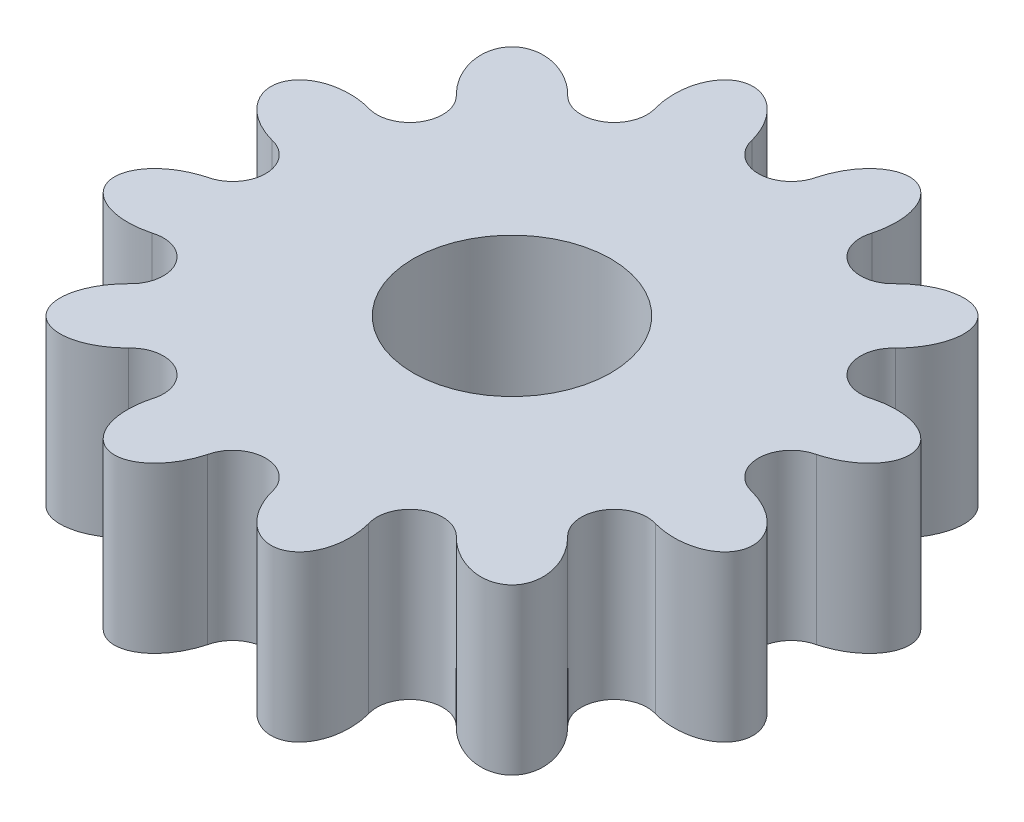
ISO-10303-21;
HEADER;
FILE_DESCRIPTION(('STEP AP214'),'2;1');
FILE_NAME('part.step','',(''),(''),'','','');
FILE_SCHEMA(('AUTOMOTIVE_DESIGN { 1 0 10303 214 1 1 1 1 }'));
ENDSEC;
DATA;
#1=APPLICATION_CONTEXT('core data for automotive mechanical design processes');
#2=APPLICATION_PROTOCOL_DEFINITION('international standard','automotive_design',2000,#1);
#3=PRODUCT_CONTEXT('',#1,'mechanical');
#4=PRODUCT('Part','Part','',(#3));
#5=PRODUCT_RELATED_PRODUCT_CATEGORY('part','',(#4));
#6=PRODUCT_DEFINITION_FORMATION('','',#4);
#7=PRODUCT_DEFINITION_CONTEXT('part definition',#1,'design');
#8=PRODUCT_DEFINITION('design','',#6,#7);
#9=PRODUCT_DEFINITION_SHAPE('','',#8);
#10=(LENGTH_UNIT() NAMED_UNIT(*) SI_UNIT(.MILLI.,.METRE.));
#11=(NAMED_UNIT(*) PLANE_ANGLE_UNIT() SI_UNIT($,.RADIAN.));
#12=(NAMED_UNIT(*) SI_UNIT($,.STERADIAN.) SOLID_ANGLE_UNIT());
#13=UNCERTAINTY_MEASURE_WITH_UNIT(LENGTH_MEASURE(1.E-05),#10,'distance_accuracy_value','');
#14=(GEOMETRIC_REPRESENTATION_CONTEXT(3) GLOBAL_UNCERTAINTY_ASSIGNED_CONTEXT((#13)) GLOBAL_UNIT_ASSIGNED_CONTEXT((#10,
#11,#12)) REPRESENTATION_CONTEXT('',''));
#15=CARTESIAN_POINT('',(0.,0.,0.));
#16=DIRECTION('',(0.,0.,1.));
#17=DIRECTION('',(1.,0.,0.));
#18=AXIS2_PLACEMENT_3D('',#15,#16,#17);
#19=CARTESIAN_POINT('',(0.,5.,-16.9523450362785));
#20=DIRECTION('',(0.,-1.,0.));
#21=DIRECTION('',(0.,0.,-1.));
#22=AXIS2_PLACEMENT_3D('',#19,#20,#21);
#23=CYLINDRICAL_SURFACE('',#22,2.);
#24=CARTESIAN_POINT('',(0.,-5.,-16.9523450362785));
#25=DIRECTION('',(0.,-1.,0.));
#26=DIRECTION('',(0.,0.,1.));
#27=AXIS2_PLACEMENT_3D('',#24,#25,#26);
#28=CIRCLE('',#27,2.);
#29=CARTESIAN_POINT('',(1.95247814611387,-5.,-16.5189525017929));
#30=VERTEX_POINT('',#29);
#31=CARTESIAN_POINT('',(-1.95247814611384,-5.,-16.5189525017929));
#32=VERTEX_POINT('',#31);
#33=EDGE_CURVE('E333',#30,#32,#28,.T.);
#34=ORIENTED_EDGE('',*,*,#33,.T.);
#35=DIRECTION('',(0.,-1.,0.));
#36=VECTOR('',#35,1.);
#37=CARTESIAN_POINT('',(-1.95247814611384,5.,-16.5189525017929));
#38=LINE('',#37,#36);
#39=CARTESIAN_POINT('',(-1.95247814611384,5.,-16.5189525017929));
#40=VERTEX_POINT('',#39);
#41=EDGE_CURVE('E233',#40,#32,#38,.T.);
#42=ORIENTED_EDGE('',*,*,#41,.F.);
#43=CARTESIAN_POINT('',(0.,5.,-16.9523450362785));
#44=DIRECTION('',(0.,-1.,0.));
#45=DIRECTION('',(0.,0.,1.));
#46=AXIS2_PLACEMENT_3D('',#43,#44,#45);
#47=CIRCLE('',#46,2.);
#48=CARTESIAN_POINT('',(1.95247814611387,5.,-16.5189525017929));
#49=VERTEX_POINT('',#48);
#50=EDGE_CURVE('E143',#49,#40,#47,.T.);
#51=ORIENTED_EDGE('',*,*,#50,.F.);
#52=DIRECTION('',(0.,-1.,0.));
#53=VECTOR('',#52,1.);
#54=CARTESIAN_POINT('',(1.95247814611387,5.,-16.5189525017929));
#55=LINE('',#54,#53);
#56=EDGE_CURVE('E49',#49,#30,#55,.T.);
#57=ORIENTED_EDGE('',*,*,#56,.T.);
#58=EDGE_LOOP('',(#34,#42,#51,#57));
#59=FACE_BOUND('',#58,.T.);
#60=ADVANCED_FACE('F50',(#59),#23,.F.);
#61=CARTESIAN_POINT('',(-8.47617251813904,5.,-14.6811614551363));
#62=DIRECTION('',(0.,-1.,0.));
#63=DIRECTION('',(0.,0.,-1.));
#64=AXIS2_PLACEMENT_3D('',#61,#62,#63);
#65=CYLINDRICAL_SURFACE('',#64,2.);
#66=CARTESIAN_POINT('',(-8.47617251813904,-5.,-14.6811614551363));
#67=DIRECTION('',(0.,-1.,0.));
#68=DIRECTION('',(0.,0.,1.));
#69=AXIS2_PLACEMENT_3D('',#66,#67,#68);
#70=CIRCLE('',#69,2.);
#71=CARTESIAN_POINT('',(-6.56858057602771,-5.,-15.2820715835182));
#72=VERTEX_POINT('',#71);
#73=CARTESIAN_POINT('',(-9.95037192576501,-5.,-13.3295934374043));
#74=VERTEX_POINT('',#73);
#75=EDGE_CURVE('E325',#72,#74,#70,.T.);
#76=ORIENTED_EDGE('',*,*,#75,.T.);
#77=DIRECTION('',(0.,-1.,0.));
#78=VECTOR('',#77,1.);
#79=CARTESIAN_POINT('',(-9.95037192576483,5.,-13.3295934374044));
#80=LINE('',#79,#78);
#81=CARTESIAN_POINT('',(-9.95037192576501,5.,-13.3295934374043));
#82=VERTEX_POINT('',#81);
#83=EDGE_CURVE('E223',#82,#74,#80,.T.);
#84=ORIENTED_EDGE('',*,*,#83,.F.);
#85=CARTESIAN_POINT('',(-8.47617251813904,5.,-14.6811614551363));
#86=DIRECTION('',(0.,-1.,0.));
#87=DIRECTION('',(0.,0.,1.));
#88=AXIS2_PLACEMENT_3D('',#85,#86,#87);
#89=CIRCLE('',#88,2.);
#90=CARTESIAN_POINT('',(-6.56858057602792,5.,-15.2820715835181));
#91=VERTEX_POINT('',#90);
#92=EDGE_CURVE('E525',#91,#82,#89,.T.);
#93=ORIENTED_EDGE('',*,*,#92,.F.);
#94=DIRECTION('',(0.,-1.,0.));
#95=VECTOR('',#94,1.);
#96=CARTESIAN_POINT('',(-6.56858057602771,5.,-15.2820715835182));
#97=LINE('',#96,#95);
#98=EDGE_CURVE('E226',#91,#72,#97,.T.);
#99=ORIENTED_EDGE('',*,*,#98,.T.);
#100=EDGE_LOOP('',(#76,#84,#93,#99));
#101=FACE_BOUND('',#100,.T.);
#102=ADVANCED_FACE('F313',(#101),#65,.F.);
#103=CARTESIAN_POINT('',(-14.6811614551361,5.,-8.47617251813942));
#104=DIRECTION('',(0.,-1.,0.));
#105=DIRECTION('',(0.,0.,-1.));
#106=AXIS2_PLACEMENT_3D('',#103,#104,#105);
#107=CYLINDRICAL_SURFACE('',#106,2.);
#108=CARTESIAN_POINT('',(-14.6811614551361,-5.,-8.47617251813942));
#109=DIRECTION('',(0.,-1.,0.));
#110=DIRECTION('',(0.,0.,1.));
#111=AXIS2_PLACEMENT_3D('',#108,#109,#110);
#112=CIRCLE('',#111,2.);
#113=CARTESIAN_POINT('',(-13.3295934374041,-5.,-9.95037192576517));
#114=VERTEX_POINT('',#113);
#115=CARTESIAN_POINT('',(-15.2820715835181,-5.,-6.5685805760279));
#116=VERTEX_POINT('',#115);
#117=EDGE_CURVE('E332',#114,#116,#112,.T.);
#118=ORIENTED_EDGE('',*,*,#117,.T.);
#119=DIRECTION('',(0.,-1.,0.));
#120=VECTOR('',#119,1.);
#121=CARTESIAN_POINT('',(-15.282071583518,5.,-6.56858057602811));
#122=LINE('',#121,#120);
#123=CARTESIAN_POINT('',(-15.2820715835181,5.,-6.5685805760279));
#124=VERTEX_POINT('',#123);
#125=EDGE_CURVE('E216',#124,#116,#122,.T.);
#126=ORIENTED_EDGE('',*,*,#125,.F.);
#127=CARTESIAN_POINT('',(-14.6811614551361,5.,-8.47617251813942));
#128=DIRECTION('',(0.,-1.,0.));
#129=DIRECTION('',(0.,0.,1.));
#130=AXIS2_PLACEMENT_3D('',#127,#128,#129);
#131=CIRCLE('',#130,2.);
#132=CARTESIAN_POINT('',(-13.3295934374043,5.,-9.95037192576499));
#133=VERTEX_POINT('',#132);
#134=EDGE_CURVE('E521',#133,#124,#131,.T.);
#135=ORIENTED_EDGE('',*,*,#134,.F.);
#136=DIRECTION('',(0.,-1.,0.));
#137=VECTOR('',#136,1.);
#138=CARTESIAN_POINT('',(-13.3295934374041,5.,-9.95037192576517));
#139=LINE('',#138,#137);
#140=EDGE_CURVE('E220',#133,#114,#139,.T.);
#141=ORIENTED_EDGE('',*,*,#140,.T.);
#142=EDGE_LOOP('',(#118,#126,#135,#141));
#143=FACE_BOUND('',#142,.T.);
#144=ADVANCED_FACE('F311',(#143),#107,.F.);
#145=CARTESIAN_POINT('',(-16.9523450362785,5.,-1.91606807165076E-13));
#146=DIRECTION('',(0.,-1.,0.));
#147=DIRECTION('',(0.,0.,-1.));
#148=AXIS2_PLACEMENT_3D('',#145,#146,#147);
#149=CYLINDRICAL_SURFACE('',#148,2.);
#150=CARTESIAN_POINT('',(-16.9523450362785,-5.,-1.91606807165076E-13));
#151=DIRECTION('',(0.,-1.,0.));
#152=DIRECTION('',(0.,0.,1.));
#153=AXIS2_PLACEMENT_3D('',#150,#151,#152);
#154=CIRCLE('',#153,2.);
#155=CARTESIAN_POINT('',(-16.5189525017929,-5.,-1.95247814611404));
#156=VERTEX_POINT('',#155);
#157=CARTESIAN_POINT('',(-16.5189525017929,-5.,1.9524781461139));
#158=VERTEX_POINT('',#157);
#159=EDGE_CURVE('E339',#156,#158,#154,.T.);
#160=ORIENTED_EDGE('',*,*,#159,.T.);
#161=DIRECTION('',(0.,-1.,0.));
#162=VECTOR('',#161,1.);
#163=CARTESIAN_POINT('',(-16.518952501793,5.,1.95247814611367));
#164=LINE('',#163,#162);
#165=CARTESIAN_POINT('',(-16.5189525017929,5.,1.9524781461139));
#166=VERTEX_POINT('',#165);
#167=EDGE_CURVE('E206',#166,#158,#164,.T.);
#168=ORIENTED_EDGE('',*,*,#167,.F.);
#169=CARTESIAN_POINT('',(-16.9523450362785,5.,-1.91606807165076E-13));
#170=DIRECTION('',(0.,-1.,0.));
#171=DIRECTION('',(0.,0.,1.));
#172=AXIS2_PLACEMENT_3D('',#169,#170,#171);
#173=CIRCLE('',#172,2.);
#174=CARTESIAN_POINT('',(-16.5189525017929,5.,-1.95247814611381));
#175=VERTEX_POINT('',#174);
#176=EDGE_CURVE('E517',#175,#166,#173,.T.);
#177=ORIENTED_EDGE('',*,*,#176,.F.);
#178=DIRECTION('',(0.,-1.,0.));
#179=VECTOR('',#178,1.);
#180=CARTESIAN_POINT('',(-16.5189525017929,5.,-1.95247814611404));
#181=LINE('',#180,#179);
#182=EDGE_CURVE('E212',#175,#156,#181,.T.);
#183=ORIENTED_EDGE('',*,*,#182,.T.);
#184=EDGE_LOOP('',(#160,#168,#177,#183));
#185=FACE_BOUND('',#184,.T.);
#186=ADVANCED_FACE('F310',(#185),#149,.F.);
#187=CARTESIAN_POINT('',(-14.6811614551363,5.,8.47617251813909));
#188=DIRECTION('',(0.,-1.,0.));
#189=DIRECTION('',(0.,0.,-1.));
#190=AXIS2_PLACEMENT_3D('',#187,#188,#189);
#191=CYLINDRICAL_SURFACE('',#190,2.);
#192=CARTESIAN_POINT('',(-14.6811614551363,-5.,8.47617251813909));
#193=DIRECTION('',(0.,-1.,0.));
#194=DIRECTION('',(0.,0.,1.));
#195=AXIS2_PLACEMENT_3D('',#192,#193,#194);
#196=CIRCLE('',#195,2.);
#197=CARTESIAN_POINT('',(-15.2820715835182,-5.,6.56858057602776));
#198=VERTEX_POINT('',#197);
#199=CARTESIAN_POINT('',(-13.3295934374042,-5.,9.95037192576506));
#200=VERTEX_POINT('',#199);
#201=EDGE_CURVE('E349',#198,#200,#196,.T.);
#202=ORIENTED_EDGE('',*,*,#201,.T.);
#203=DIRECTION('',(0.,-1.,0.));
#204=VECTOR('',#203,1.);
#205=CARTESIAN_POINT('',(-13.3295934374044,5.,9.95037192576487));
#206=LINE('',#205,#204);
#207=CARTESIAN_POINT('',(-13.3295934374042,5.,9.95037192576506));
#208=VERTEX_POINT('',#207);
#209=EDGE_CURVE('E200',#208,#200,#206,.T.);
#210=ORIENTED_EDGE('',*,*,#209,.F.);
#211=CARTESIAN_POINT('',(-14.6811614551363,5.,8.47617251813909));
#212=DIRECTION('',(0.,-1.,0.));
#213=DIRECTION('',(0.,0.,1.));
#214=AXIS2_PLACEMENT_3D('',#211,#212,#213);
#215=CIRCLE('',#214,2.);
#216=CARTESIAN_POINT('',(-15.2820715835181,5.,6.56858057602798));
#217=VERTEX_POINT('',#216);
#218=EDGE_CURVE('E514',#217,#208,#215,.T.);
#219=ORIENTED_EDGE('',*,*,#218,.F.);
#220=DIRECTION('',(0.,-1.,0.));
#221=VECTOR('',#220,1.);
#222=CARTESIAN_POINT('',(-15.2820715835182,5.,6.56858057602776));
#223=LINE('',#222,#221);
#224=EDGE_CURVE('E203',#217,#198,#223,.T.);
#225=ORIENTED_EDGE('',*,*,#224,.T.);
#226=EDGE_LOOP('',(#202,#210,#219,#225));
#227=FACE_BOUND('',#226,.T.);
#228=ADVANCED_FACE('F303',(#227),#191,.F.);
#229=CARTESIAN_POINT('',(-8.47617251813937,5.,14.6811614551361));
#230=DIRECTION('',(0.,-1.,0.));
#231=DIRECTION('',(0.,0.,-1.));
#232=AXIS2_PLACEMENT_3D('',#229,#230,#231);
#233=CYLINDRICAL_SURFACE('',#232,2.);
#234=CARTESIAN_POINT('',(-8.47617251813937,-5.,14.6811614551361));
#235=DIRECTION('',(0.,-1.,0.));
#236=DIRECTION('',(0.,0.,1.));
#237=AXIS2_PLACEMENT_3D('',#234,#235,#236);
#238=CIRCLE('',#237,2.);
#239=CARTESIAN_POINT('',(-9.95037192576513,-5.,13.3295934374042));
#240=VERTEX_POINT('',#239);
#241=CARTESIAN_POINT('',(-6.56858057602795,-5.,15.2820715835181));
#242=VERTEX_POINT('',#241);
#243=EDGE_CURVE('E355',#240,#242,#238,.T.);
#244=ORIENTED_EDGE('',*,*,#243,.T.);
#245=DIRECTION('',(0.,-1.,0.));
#246=VECTOR('',#245,1.);
#247=CARTESIAN_POINT('',(-6.56858057602806,5.,15.2820715835181));
#248=LINE('',#247,#246);
#249=CARTESIAN_POINT('',(-6.56858057602795,5.,15.2820715835181));
#250=VERTEX_POINT('',#249);
#251=EDGE_CURVE('E192',#250,#242,#248,.T.);
#252=ORIENTED_EDGE('',*,*,#251,.F.);
#253=CARTESIAN_POINT('',(-8.47617251813937,5.,14.6811614551361));
#254=DIRECTION('',(0.,-1.,0.));
#255=DIRECTION('',(0.,0.,1.));
#256=AXIS2_PLACEMENT_3D('',#253,#254,#255);
#257=CIRCLE('',#256,2.);
#258=CARTESIAN_POINT('',(-9.95037192576494,5.,13.3295934374043));
#259=VERTEX_POINT('',#258);
#260=EDGE_CURVE('E508',#259,#250,#257,.T.);
#261=ORIENTED_EDGE('',*,*,#260,.F.);
#262=DIRECTION('',(0.,-1.,0.));
#263=VECTOR('',#262,1.);
#264=CARTESIAN_POINT('',(-9.95037192576513,5.,13.3295934374042));
#265=LINE('',#264,#263);
#266=EDGE_CURVE('E196',#259,#240,#265,.T.);
#267=ORIENTED_EDGE('',*,*,#266,.T.);
#268=EDGE_LOOP('',(#244,#252,#261,#267));
#269=FACE_BOUND('',#268,.T.);
#270=ADVANCED_FACE('F299',(#269),#233,.F.);
#271=CARTESIAN_POINT('',(-1.3241801082128E-13,5.,16.9523450362785));
#272=DIRECTION('',(0.,-1.,0.));
#273=DIRECTION('',(0.,0.,-1.));
#274=AXIS2_PLACEMENT_3D('',#271,#272,#273);
#275=CYLINDRICAL_SURFACE('',#274,2.);
#276=CARTESIAN_POINT('',(-1.3241801082128E-13,-5.,16.9523450362785));
#277=DIRECTION('',(0.,-1.,0.));
#278=DIRECTION('',(0.,0.,1.));
#279=AXIS2_PLACEMENT_3D('',#276,#277,#278);
#280=CIRCLE('',#279,2.);
#281=CARTESIAN_POINT('',(-1.95247814611398,-5.,16.5189525017929));
#282=VERTEX_POINT('',#281);
#283=CARTESIAN_POINT('',(1.95247814611396,-5.,16.5189525017929));
#284=VERTEX_POINT('',#283);
#285=EDGE_CURVE('E358',#282,#284,#280,.T.);
#286=ORIENTED_EDGE('',*,*,#285,.T.);
#287=DIRECTION('',(0.,-1.,0.));
#288=VECTOR('',#287,1.);
#289=CARTESIAN_POINT('',(1.95247814611373,5.,16.5189525017929));
#290=LINE('',#289,#288);
#291=CARTESIAN_POINT('',(1.95247814611396,5.,16.5189525017929));
#292=VERTEX_POINT('',#291);
#293=EDGE_CURVE('E183',#292,#284,#290,.T.);
#294=ORIENTED_EDGE('',*,*,#293,.F.);
#295=CARTESIAN_POINT('',(-1.3241801082128E-13,5.,16.9523450362785));
#296=DIRECTION('',(0.,-1.,0.));
#297=DIRECTION('',(0.,0.,1.));
#298=AXIS2_PLACEMENT_3D('',#295,#296,#297);
#299=CIRCLE('',#298,2.);
#300=CARTESIAN_POINT('',(-1.95247814611387,5.,16.5189525017929));
#301=VERTEX_POINT('',#300);
#302=EDGE_CURVE('E504',#301,#292,#299,.T.);
#303=ORIENTED_EDGE('',*,*,#302,.F.);
#304=DIRECTION('',(0.,-1.,0.));
#305=VECTOR('',#304,1.);
#306=CARTESIAN_POINT('',(-1.95247814611398,5.,16.5189525017929));
#307=LINE('',#306,#305);
#308=EDGE_CURVE('E189',#301,#282,#307,.T.);
#309=ORIENTED_EDGE('',*,*,#308,.T.);
#310=EDGE_LOOP('',(#286,#294,#303,#309));
#311=FACE_BOUND('',#310,.T.);
#312=ADVANCED_FACE('F294',(#311),#275,.F.);
#313=CARTESIAN_POINT('',(8.47617251813914,5.,14.6811614551362));
#314=DIRECTION('',(0.,-1.,0.));
#315=DIRECTION('',(0.,0.,-1.));
#316=AXIS2_PLACEMENT_3D('',#313,#314,#315);
#317=CYLINDRICAL_SURFACE('',#316,2.);
#318=CARTESIAN_POINT('',(8.47617251813914,-5.,14.6811614551362));
#319=DIRECTION('',(0.,-1.,0.));
#320=DIRECTION('',(0.,0.,1.));
#321=AXIS2_PLACEMENT_3D('',#318,#319,#320);
#322=CIRCLE('',#321,2.);
#323=CARTESIAN_POINT('',(6.56858057602782,-5.,15.2820715835181));
#324=VERTEX_POINT('',#323);
#325=CARTESIAN_POINT('',(9.9503719257651,-5.,13.3295934374042));
#326=VERTEX_POINT('',#325);
#327=EDGE_CURVE('E359',#324,#326,#322,.T.);
#328=ORIENTED_EDGE('',*,*,#327,.T.);
#329=DIRECTION('',(0.,-1.,0.));
#330=VECTOR('',#329,1.);
#331=CARTESIAN_POINT('',(9.95037192576492,5.,13.3295934374043));
#332=LINE('',#331,#330);
#333=CARTESIAN_POINT('',(9.9503719257651,5.,13.3295934374042));
#334=VERTEX_POINT('',#333);
#335=EDGE_CURVE('E176',#334,#326,#332,.T.);
#336=ORIENTED_EDGE('',*,*,#335,.F.);
#337=CARTESIAN_POINT('',(8.47617251813914,5.,14.6811614551362));
#338=DIRECTION('',(0.,-1.,0.));
#339=DIRECTION('',(0.,0.,1.));
#340=AXIS2_PLACEMENT_3D('',#337,#338,#339);
#341=CIRCLE('',#340,2.);
#342=CARTESIAN_POINT('',(6.56858057602803,5.,15.2820715835181));
#343=VERTEX_POINT('',#342);
#344=EDGE_CURVE('E501',#343,#334,#341,.T.);
#345=ORIENTED_EDGE('',*,*,#344,.F.);
#346=DIRECTION('',(0.,-1.,0.));
#347=VECTOR('',#346,1.);
#348=CARTESIAN_POINT('',(6.56858057602782,5.,15.2820715835181));
#349=LINE('',#348,#347);
#350=EDGE_CURVE('E179',#343,#324,#349,.T.);
#351=ORIENTED_EDGE('',*,*,#350,.T.);
#352=EDGE_LOOP('',(#328,#336,#345,#351));
#353=FACE_BOUND('',#352,.T.);
#354=ADVANCED_FACE('F293',(#353),#317,.F.);
#355=CARTESIAN_POINT('',(14.6811614551361,5.,8.47617251813932));
#356=DIRECTION('',(0.,-1.,0.));
#357=DIRECTION('',(0.,0.,-1.));
#358=AXIS2_PLACEMENT_3D('',#355,#356,#357);
#359=CYLINDRICAL_SURFACE('',#358,2.);
#360=CARTESIAN_POINT('',(14.6811614551361,-5.,8.47617251813932));
#361=DIRECTION('',(0.,-1.,0.));
#362=DIRECTION('',(0.,0.,1.));
#363=AXIS2_PLACEMENT_3D('',#360,#361,#362);
#364=CIRCLE('',#363,2.);
#365=CARTESIAN_POINT('',(13.3295934374042,-5.,9.95037192576508));
#366=VERTEX_POINT('',#365);
#367=CARTESIAN_POINT('',(15.2820715835182,-5.,6.56858057602779));
#368=VERTEX_POINT('',#367);
#369=EDGE_CURVE('E147',#366,#368,#364,.T.);
#370=ORIENTED_EDGE('',*,*,#369,.T.);
#371=DIRECTION('',(0.,-1.,0.));
#372=VECTOR('',#371,1.);
#373=CARTESIAN_POINT('',(15.2820715835181,5.,6.568580576028));
#374=LINE('',#373,#372);
#375=CARTESIAN_POINT('',(15.2820715835182,5.,6.56858057602779));
#376=VERTEX_POINT('',#375);
#377=EDGE_CURVE('E166',#376,#368,#374,.T.);
#378=ORIENTED_EDGE('',*,*,#377,.F.);
#379=CARTESIAN_POINT('',(14.6811614551361,5.,8.47617251813932));
#380=DIRECTION('',(0.,-1.,0.));
#381=DIRECTION('',(0.,0.,1.));
#382=AXIS2_PLACEMENT_3D('',#379,#380,#381);
#383=CIRCLE('',#382,2.);
#384=CARTESIAN_POINT('',(13.3295934374043,5.,9.95037192576489));
#385=VERTEX_POINT('',#384);
#386=EDGE_CURVE('E500',#385,#376,#383,.T.);
#387=ORIENTED_EDGE('',*,*,#386,.F.);
#388=DIRECTION('',(0.,-1.,0.));
#389=VECTOR('',#388,1.);
#390=CARTESIAN_POINT('',(13.3295934374042,5.,9.95037192576508));
#391=LINE('',#390,#389);
#392=EDGE_CURVE('E175',#385,#366,#391,.T.);
#393=ORIENTED_EDGE('',*,*,#392,.T.);
#394=EDGE_LOOP('',(#370,#378,#387,#393));
#395=FACE_BOUND('',#394,.T.);
#396=ADVANCED_FACE('F290',(#395),#359,.F.);
#397=CARTESIAN_POINT('',(16.9523450362785,5.,0.));
#398=DIRECTION('',(0.,-1.,0.));
#399=DIRECTION('',(0.,0.,-1.));
#400=AXIS2_PLACEMENT_3D('',#397,#398,#399);
#401=CYLINDRICAL_SURFACE('',#400,2.);
#402=CARTESIAN_POINT('',(16.9523450362785,-5.,0.));
#403=DIRECTION('',(0.,-1.,0.));
#404=DIRECTION('',(0.,0.,1.));
#405=AXIS2_PLACEMENT_3D('',#402,#403,#404);
#406=CIRCLE('',#405,2.);
#407=CARTESIAN_POINT('',(16.5189525017929,-5.,1.95247814611393));
#408=VERTEX_POINT('',#407);
#409=CARTESIAN_POINT('',(16.5189525017929,-5.,-1.95247814611401));
#410=VERTEX_POINT('',#409);
#411=EDGE_CURVE('E139',#408,#410,#406,.T.);
#412=ORIENTED_EDGE('',*,*,#411,.T.);
#413=DIRECTION('',(0.,-1.,0.));
#414=VECTOR('',#413,1.);
#415=CARTESIAN_POINT('',(16.5189525017929,5.,-1.95247814611378));
#416=LINE('',#415,#414);
#417=CARTESIAN_POINT('',(16.5189525017929,5.,-1.95247814611401));
#418=VERTEX_POINT('',#417);
#419=EDGE_CURVE('E112',#418,#410,#416,.T.);
#420=ORIENTED_EDGE('',*,*,#419,.F.);
#421=CARTESIAN_POINT('',(16.9523450362785,5.,0.));
#422=DIRECTION('',(0.,-1.,0.));
#423=DIRECTION('',(0.,0.,1.));
#424=AXIS2_PLACEMENT_3D('',#421,#422,#423);
#425=CIRCLE('',#424,2.);
#426=CARTESIAN_POINT('',(16.5189525017929,5.,1.9524781461137));
#427=VERTEX_POINT('',#426);
#428=EDGE_CURVE('E493',#427,#418,#425,.T.);
#429=ORIENTED_EDGE('',*,*,#428,.F.);
#430=DIRECTION('',(0.,-1.,0.));
#431=VECTOR('',#430,1.);
#432=CARTESIAN_POINT('',(16.5189525017929,5.,1.95247814611393));
#433=LINE('',#432,#431);
#434=EDGE_CURVE('E165',#427,#408,#433,.T.);
#435=ORIENTED_EDGE('',*,*,#434,.T.);
#436=EDGE_LOOP('',(#412,#420,#429,#435));
#437=FACE_BOUND('',#436,.T.);
#438=ADVANCED_FACE('F283',(#437),#401,.F.);
#439=CARTESIAN_POINT('',(14.6811614551362,5.,-8.47617251813919));
#440=DIRECTION('',(0.,-1.,0.));
#441=DIRECTION('',(0.,0.,-1.));
#442=AXIS2_PLACEMENT_3D('',#439,#440,#441);
#443=CYLINDRICAL_SURFACE('',#442,2.);
#444=CARTESIAN_POINT('',(14.6811614551362,-5.,-8.47617251813919));
#445=DIRECTION('',(0.,-1.,0.));
#446=DIRECTION('',(0.,0.,1.));
#447=AXIS2_PLACEMENT_3D('',#444,#445,#446);
#448=CIRCLE('',#447,2.);
#449=CARTESIAN_POINT('',(15.2820715835181,-5.,-6.56858057602787));
#450=VERTEX_POINT('',#449);
#451=CARTESIAN_POINT('',(13.3295934374042,-5.,-9.95037192576515));
#452=VERTEX_POINT('',#451);
#453=EDGE_CURVE('E129',#450,#452,#448,.T.);
#454=ORIENTED_EDGE('',*,*,#453,.T.);
#455=DIRECTION('',(0.,-1.,0.));
#456=VECTOR('',#455,1.);
#457=CARTESIAN_POINT('',(13.3295934374043,5.,-9.95037192576496));
#458=LINE('',#457,#456);
#459=CARTESIAN_POINT('',(13.3295934374042,5.,-9.95037192576515));
#460=VERTEX_POINT('',#459);
#461=EDGE_CURVE('E132',#460,#452,#458,.T.);
#462=ORIENTED_EDGE('',*,*,#461,.F.);
#463=CARTESIAN_POINT('',(14.6811614551362,5.,-8.47617251813919));
#464=DIRECTION('',(0.,-1.,0.));
#465=DIRECTION('',(0.,0.,1.));
#466=AXIS2_PLACEMENT_3D('',#463,#464,#465);
#467=CIRCLE('',#466,2.);
#468=CARTESIAN_POINT('',(15.282071583518,5.,-6.56858057602808));
#469=VERTEX_POINT('',#468);
#470=EDGE_CURVE('E130',#469,#460,#467,.T.);
#471=ORIENTED_EDGE('',*,*,#470,.F.);
#472=DIRECTION('',(0.,-1.,0.));
#473=VECTOR('',#472,1.);
#474=CARTESIAN_POINT('',(15.2820715835181,5.,-6.56858057602787));
#475=LINE('',#474,#473);
#476=EDGE_CURVE('E109',#469,#450,#475,.T.);
#477=ORIENTED_EDGE('',*,*,#476,.T.);
#478=EDGE_LOOP('',(#454,#462,#471,#477));
#479=FACE_BOUND('',#478,.T.);
#480=ADVANCED_FACE('F123',(#479),#443,.F.);
#481=CARTESIAN_POINT('',(8.47617251813927,5.,-14.6811614551362));
#482=DIRECTION('',(0.,-1.,0.));
#483=DIRECTION('',(0.,0.,-1.));
#484=AXIS2_PLACEMENT_3D('',#481,#482,#483);
#485=CYLINDRICAL_SURFACE('',#484,2.);
#486=CARTESIAN_POINT('',(8.47617251813927,-5.,-14.6811614551362));
#487=DIRECTION('',(0.,-1.,0.));
#488=DIRECTION('',(0.,0.,1.));
#489=AXIS2_PLACEMENT_3D('',#486,#487,#488);
#490=CIRCLE('',#489,2.);
#491=CARTESIAN_POINT('',(9.95037192576503,-5.,-13.3295934374042));
#492=VERTEX_POINT('',#491);
#493=CARTESIAN_POINT('',(6.56858057602795,-5.,-15.2820715835181));
#494=VERTEX_POINT('',#493);
#495=EDGE_CURVE('E138',#492,#494,#490,.T.);
#496=ORIENTED_EDGE('',*,*,#495,.T.);
#497=DIRECTION('',(0.,-1.,0.));
#498=VECTOR('',#497,1.);
#499=CARTESIAN_POINT('',(6.56858057602795,5.,-15.2820715835181));
#500=LINE('',#499,#498);
#501=CARTESIAN_POINT('',(6.56858057602795,5.,-15.2820715835181));
#502=VERTEX_POINT('',#501);
#503=EDGE_CURVE('E151',#502,#494,#500,.T.);
#504=ORIENTED_EDGE('',*,*,#503,.F.);
#505=CARTESIAN_POINT('',(8.47617251813927,5.,-14.6811614551362));
#506=DIRECTION('',(0.,-1.,0.));
#507=DIRECTION('',(0.,0.,1.));
#508=AXIS2_PLACEMENT_3D('',#505,#506,#507);
#509=CIRCLE('',#508,2.);
#510=CARTESIAN_POINT('',(9.95037192576484,5.,-13.3295934374044));
#511=VERTEX_POINT('',#510);
#512=EDGE_CURVE('E155',#511,#502,#509,.T.);
#513=ORIENTED_EDGE('',*,*,#512,.F.);
#514=DIRECTION('',(0.,-1.,0.));
#515=VECTOR('',#514,1.);
#516=CARTESIAN_POINT('',(9.95037192576503,5.,-13.3295934374042));
#517=LINE('',#516,#515);
#518=EDGE_CURVE('E153',#511,#492,#517,.T.);
#519=ORIENTED_EDGE('',*,*,#518,.T.);
#520=EDGE_LOOP('',(#496,#504,#513,#519));
#521=FACE_BOUND('',#520,.T.);
#522=ADVANCED_FACE('F274',(#521),#485,.F.);
#523=CARTESIAN_POINT('',(0.,5.,0.));
#524=DIRECTION('',(0.,1.,0.));
#525=DIRECTION('',(0.,0.,1.));
#526=AXIS2_PLACEMENT_3D('',#523,#524,#525);
#527=PLANE('',#526);
#528=CARTESIAN_POINT('',(-11.6399826815846,5.,-11.6399826815846));
#529=DIRECTION('',(0.,-1.,0.));
#530=DIRECTION('',(0.707106781186549,0.,0.707106781186547));
#531=AXIS2_PLACEMENT_3D('',#528,#529,#530);
#532=ELLIPSE('',#531,3.53857862591509,2.38947044601158);
#533=EDGE_CURVE('E446',#133,#82,#532,.T.);
#534=ORIENTED_EDGE('',*,*,#533,.F.);
#535=ORIENTED_EDGE('',*,*,#134,.T.);
#536=CARTESIAN_POINT('',(-15.9005120426555,5.,-4.26052936107086));
#537=DIRECTION('',(0.,-1.,0.));
#538=DIRECTION('',(0.965925826289069,0.,0.258819045102518));
#539=AXIS2_PLACEMENT_3D('',#536,#537,#538);
#540=ELLIPSE('',#539,3.53857862591509,2.38947044601158);
#541=EDGE_CURVE('E441',#175,#124,#540,.T.);
#542=ORIENTED_EDGE('',*,*,#541,.F.);
#543=ORIENTED_EDGE('',*,*,#176,.T.);
#544=CARTESIAN_POINT('',(-15.9005120426555,5.,4.26052936107094));
#545=DIRECTION('',(0.,-1.,0.));
#546=DIRECTION('',(0.965925826289068,0.,-0.258819045102524));
#547=AXIS2_PLACEMENT_3D('',#544,#545,#546);
#548=ELLIPSE('',#547,3.53857862591509,2.38947044601158);
#549=EDGE_CURVE('E438',#217,#166,#548,.T.);
#550=ORIENTED_EDGE('',*,*,#549,.F.);
#551=ORIENTED_EDGE('',*,*,#218,.T.);
#552=CARTESIAN_POINT('',(-11.6399826815846,5.,11.6399826815847));
#553=DIRECTION('',(0.,-1.,0.));
#554=DIRECTION('',(0.707106781186544,0.,-0.707106781186551));
#555=AXIS2_PLACEMENT_3D('',#552,#553,#554);
#556=ELLIPSE('',#555,3.53857862591509,2.38947044601158);
#557=EDGE_CURVE('E415',#259,#208,#556,.T.);
#558=ORIENTED_EDGE('',*,*,#557,.F.);
#559=ORIENTED_EDGE('',*,*,#260,.T.);
#560=CARTESIAN_POINT('',(-4.26052936107091,5.,15.9005120426555));
#561=DIRECTION('',(0.,-1.,0.));
#562=DIRECTION('',(0.258819045102522,0.,-0.965925826289068));
#563=AXIS2_PLACEMENT_3D('',#560,#561,#562);
#564=ELLIPSE('',#563,3.53857862591509,2.38947044601158);
#565=EDGE_CURVE('E406',#301,#250,#564,.T.);
#566=ORIENTED_EDGE('',*,*,#565,.F.);
#567=ORIENTED_EDGE('',*,*,#302,.T.);
#568=CARTESIAN_POINT('',(4.26052936107099,5.,15.9005120426555));
#569=DIRECTION('',(0.,-1.,0.));
#570=DIRECTION('',(-0.258819045102528,0.,-0.965925826289067));
#571=AXIS2_PLACEMENT_3D('',#568,#569,#570);
#572=ELLIPSE('',#571,3.53857862591509,2.38947044601158);
#573=EDGE_CURVE('E401',#343,#292,#572,.T.);
#574=ORIENTED_EDGE('',*,*,#573,.F.);
#575=ORIENTED_EDGE('',*,*,#344,.T.);
#576=CARTESIAN_POINT('',(11.6399826815847,5.,11.6399826815845));
#577=DIRECTION('',(0.,-1.,0.));
#578=DIRECTION('',(-0.707106781186554,0.,-0.707106781186542));
#579=AXIS2_PLACEMENT_3D('',#576,#577,#578);
#580=ELLIPSE('',#579,3.53857862591509,2.38947044601158);
#581=EDGE_CURVE('E388',#385,#334,#580,.T.);
#582=ORIENTED_EDGE('',*,*,#581,.F.);
#583=ORIENTED_EDGE('',*,*,#386,.T.);
#584=CARTESIAN_POINT('',(15.9005120426556,5.,4.26052936107074));
#585=DIRECTION('',(0.,-1.,0.));
#586=DIRECTION('',(-0.965925826289071,0.,-0.258819045102512));
#587=AXIS2_PLACEMENT_3D('',#584,#585,#586);
#588=ELLIPSE('',#587,3.53857862591509,2.38947044601158);
#589=EDGE_CURVE('E390',#427,#376,#588,.T.);
#590=ORIENTED_EDGE('',*,*,#589,.F.);
#591=ORIENTED_EDGE('',*,*,#428,.T.);
#592=CARTESIAN_POINT('',(15.9005120426555,5.,-4.26052936107105));
#593=DIRECTION('',(0.,-1.,0.));
#594=DIRECTION('',(-0.965925826289066,0.,0.258819045102531));
#595=AXIS2_PLACEMENT_3D('',#592,#593,#594);
#596=ELLIPSE('',#595,3.53857862591509,2.38947044601158);
#597=EDGE_CURVE('E469',#469,#418,#596,.T.);
#598=ORIENTED_EDGE('',*,*,#597,.F.);
#599=ORIENTED_EDGE('',*,*,#470,.T.);
#600=CARTESIAN_POINT('',(11.6399826815845,5.,-11.6399826815848));
#601=DIRECTION('',(0.,-1.,0.));
#602=DIRECTION('',(-0.707106781186539,0.,0.707106781186556));
#603=AXIS2_PLACEMENT_3D('',#600,#601,#602);
#604=ELLIPSE('',#603,3.53857862591509,2.38947044601158);
#605=EDGE_CURVE('E467',#511,#460,#604,.T.);
#606=ORIENTED_EDGE('',*,*,#605,.F.);
#607=ORIENTED_EDGE('',*,*,#512,.T.);
#608=CARTESIAN_POINT('',(4.26052936107091,5.,-15.9005120426555));
#609=DIRECTION('',(0.,-1.,0.));
#610=DIRECTION('',(-0.258819045102522,0.,0.965925826289068));
#611=AXIS2_PLACEMENT_3D('',#608,#609,#610);
#612=ELLIPSE('',#611,3.53857862591509,2.38947044601158);
#613=EDGE_CURVE('E65',#49,#502,#612,.T.);
#614=ORIENTED_EDGE('',*,*,#613,.F.);
#615=ORIENTED_EDGE('',*,*,#50,.T.);
#616=CARTESIAN_POINT('',(-4.26052936107088,5.,-15.9005120426555));
#617=DIRECTION('',(0.,-1.,0.));
#618=DIRECTION('',(0.258819045102521,0.,0.965925826289068));
#619=AXIS2_PLACEMENT_3D('',#616,#617,#618);
#620=ELLIPSE('',#619,3.53857862591509,2.38947044601158);
#621=EDGE_CURVE('E257',#91,#40,#620,.T.);
#622=ORIENTED_EDGE('',*,*,#621,.F.);
#623=ORIENTED_EDGE('',*,*,#92,.T.);
#624=EDGE_LOOP('',(#534,#535,#542,#543,#550,#551,#558,#559,#566,#567,#574,#575,#582,#583,#590,
#591,#598,#599,#606,#607,#614,#615,#622,#623));
#625=FACE_BOUND('',#624,.T.);
#626=CARTESIAN_POINT('',(0.,5.,0.));
#627=DIRECTION('',(0.,1.,0.));
#628=DIRECTION('',(0.,0.,1.));
#629=AXIS2_PLACEMENT_3D('',#626,#627,#628);
#630=CIRCLE('',#629,6.);
#631=CARTESIAN_POINT('',(0.,5.,6.));
#632=VERTEX_POINT('',#631);
#633=EDGE_CURVE('E535',#632,#632,#630,.T.);
#634=ORIENTED_EDGE('',*,*,#633,.F.);
#635=EDGE_LOOP('',(#634));
#636=FACE_BOUND('',#635,.T.);
#637=ADVANCED_FACE('F272',(#625,#636),#527,.T.);
#638=CARTESIAN_POINT('',(0.,-5.,0.));
#639=DIRECTION('',(0.,1.,0.));
#640=DIRECTION('',(0.,0.,1.));
#641=AXIS2_PLACEMENT_3D('',#638,#639,#640);
#642=PLANE('',#641);
#643=CARTESIAN_POINT('',(0.,-5.,0.));
#644=DIRECTION('',(0.,1.,0.));
#645=DIRECTION('',(0.,0.,1.));
#646=AXIS2_PLACEMENT_3D('',#643,#644,#645);
#647=CIRCLE('',#646,6.);
#648=CARTESIAN_POINT('',(0.,-5.,6.));
#649=VERTEX_POINT('',#648);
#650=EDGE_CURVE('E341',#649,#649,#647,.T.);
#651=ORIENTED_EDGE('',*,*,#650,.T.);
#652=EDGE_LOOP('',(#651));
#653=FACE_BOUND('',#652,.T.);
#654=ORIENTED_EDGE('',*,*,#117,.F.);
#655=CARTESIAN_POINT('',(-11.6399826815846,-5.,-11.6399826815846));
#656=DIRECTION('',(0.,-1.,0.));
#657=DIRECTION('',(0.707106781186549,0.,0.707106781186547));
#658=AXIS2_PLACEMENT_3D('',#655,#656,#657);
#659=ELLIPSE('',#658,3.53857862591509,2.38947044601158);
#660=EDGE_CURVE('E11',#114,#74,#659,.T.);
#661=ORIENTED_EDGE('',*,*,#660,.T.);
#662=ORIENTED_EDGE('',*,*,#75,.F.);
#663=CARTESIAN_POINT('',(-4.26052936107088,-5.,-15.9005120426555));
#664=DIRECTION('',(0.,-1.,0.));
#665=DIRECTION('',(0.258819045102521,0.,0.965925826289068));
#666=AXIS2_PLACEMENT_3D('',#663,#664,#665);
#667=ELLIPSE('',#666,3.53857862591509,2.38947044601158);
#668=EDGE_CURVE('E247',#72,#32,#667,.T.);
#669=ORIENTED_EDGE('',*,*,#668,.T.);
#670=ORIENTED_EDGE('',*,*,#33,.F.);
#671=CARTESIAN_POINT('',(4.26052936107091,-5.,-15.9005120426555));
#672=DIRECTION('',(0.,-1.,0.));
#673=DIRECTION('',(-0.258819045102522,0.,0.965925826289068));
#674=AXIS2_PLACEMENT_3D('',#671,#672,#673);
#675=ELLIPSE('',#674,3.53857862591509,2.38947044601158);
#676=EDGE_CURVE('E241',#30,#494,#675,.T.);
#677=ORIENTED_EDGE('',*,*,#676,.T.);
#678=ORIENTED_EDGE('',*,*,#495,.F.);
#679=CARTESIAN_POINT('',(11.6399826815845,-5.,-11.6399826815848));
#680=DIRECTION('',(0.,-1.,0.));
#681=DIRECTION('',(-0.707106781186539,0.,0.707106781186556));
#682=AXIS2_PLACEMENT_3D('',#679,#680,#681);
#683=ELLIPSE('',#682,3.53857862591509,2.38947044601158);
#684=EDGE_CURVE('E122',#492,#452,#683,.T.);
#685=ORIENTED_EDGE('',*,*,#684,.T.);
#686=ORIENTED_EDGE('',*,*,#453,.F.);
#687=CARTESIAN_POINT('',(15.9005120426555,-5.,-4.26052936107105));
#688=DIRECTION('',(0.,-1.,0.));
#689=DIRECTION('',(-0.965925826289066,0.,0.258819045102531));
#690=AXIS2_PLACEMENT_3D('',#687,#688,#689);
#691=ELLIPSE('',#690,3.53857862591509,2.38947044601158);
#692=EDGE_CURVE('E102',#450,#410,#691,.T.);
#693=ORIENTED_EDGE('',*,*,#692,.T.);
#694=ORIENTED_EDGE('',*,*,#411,.F.);
#695=CARTESIAN_POINT('',(15.9005120426556,-5.,4.26052936107074));
#696=DIRECTION('',(0.,-1.,0.));
#697=DIRECTION('',(-0.965925826289071,0.,-0.258819045102512));
#698=AXIS2_PLACEMENT_3D('',#695,#696,#697);
#699=ELLIPSE('',#698,3.53857862591509,2.38947044601158);
#700=EDGE_CURVE('E119',#408,#368,#699,.T.);
#701=ORIENTED_EDGE('',*,*,#700,.T.);
#702=ORIENTED_EDGE('',*,*,#369,.F.);
#703=CARTESIAN_POINT('',(11.6399826815847,-5.,11.6399826815845));
#704=DIRECTION('',(0.,-1.,0.));
#705=DIRECTION('',(-0.707106781186554,0.,-0.707106781186542));
#706=AXIS2_PLACEMENT_3D('',#703,#704,#705);
#707=ELLIPSE('',#706,3.53857862591509,2.38947044601158);
#708=EDGE_CURVE('E377',#366,#326,#707,.T.);
#709=ORIENTED_EDGE('',*,*,#708,.T.);
#710=ORIENTED_EDGE('',*,*,#327,.F.);
#711=CARTESIAN_POINT('',(4.26052936107099,-5.,15.9005120426555));
#712=DIRECTION('',(0.,-1.,0.));
#713=DIRECTION('',(-0.258819045102528,0.,-0.965925826289067));
#714=AXIS2_PLACEMENT_3D('',#711,#712,#713);
#715=ELLIPSE('',#714,3.53857862591509,2.38947044601158);
#716=EDGE_CURVE('E381',#324,#284,#715,.T.);
#717=ORIENTED_EDGE('',*,*,#716,.T.);
#718=ORIENTED_EDGE('',*,*,#285,.F.);
#719=CARTESIAN_POINT('',(-4.26052936107091,-5.,15.9005120426555));
#720=DIRECTION('',(0.,-1.,0.));
#721=DIRECTION('',(0.258819045102522,0.,-0.965925826289068));
#722=AXIS2_PLACEMENT_3D('',#719,#720,#721);
#723=ELLIPSE('',#722,3.53857862591509,2.38947044601158);
#724=EDGE_CURVE('E411',#282,#242,#723,.T.);
#725=ORIENTED_EDGE('',*,*,#724,.T.);
#726=ORIENTED_EDGE('',*,*,#243,.F.);
#727=CARTESIAN_POINT('',(-11.6399826815846,-5.,11.6399826815847));
#728=DIRECTION('',(0.,-1.,0.));
#729=DIRECTION('',(0.707106781186544,0.,-0.707106781186551));
#730=AXIS2_PLACEMENT_3D('',#727,#728,#729);
#731=ELLIPSE('',#730,3.53857862591509,2.38947044601158);
#732=EDGE_CURVE('E419',#240,#200,#731,.T.);
#733=ORIENTED_EDGE('',*,*,#732,.T.);
#734=ORIENTED_EDGE('',*,*,#201,.F.);
#735=CARTESIAN_POINT('',(-15.9005120426555,-5.,4.26052936107094));
#736=DIRECTION('',(0.,-1.,0.));
#737=DIRECTION('',(0.965925826289068,0.,-0.258819045102524));
#738=AXIS2_PLACEMENT_3D('',#735,#736,#737);
#739=ELLIPSE('',#738,3.53857862591509,2.38947044601158);
#740=EDGE_CURVE('E440',#198,#158,#739,.T.);
#741=ORIENTED_EDGE('',*,*,#740,.T.);
#742=ORIENTED_EDGE('',*,*,#159,.F.);
#743=CARTESIAN_POINT('',(-15.9005120426555,-5.,-4.26052936107086));
#744=DIRECTION('',(0.,-1.,0.));
#745=DIRECTION('',(0.965925826289069,0.,0.258819045102518));
#746=AXIS2_PLACEMENT_3D('',#743,#744,#745);
#747=ELLIPSE('',#746,3.53857862591509,2.38947044601158);
#748=EDGE_CURVE('E60',#156,#116,#747,.T.);
#749=ORIENTED_EDGE('',*,*,#748,.T.);
#750=EDGE_LOOP('',(#654,#661,#662,#669,#670,#677,#678,#685,#686,#693,#694,#701,#702,#709,#710,
#717,#718,#725,#726,#733,#734,#741,#742,#749));
#751=FACE_BOUND('',#750,.T.);
#752=ADVANCED_FACE('F136',(#653,#751),#642,.F.);
#753=CARTESIAN_POINT('',(0.,-5.,0.));
#754=DIRECTION('',(0.,1.,0.));
#755=DIRECTION('',(0.,0.,1.));
#756=AXIS2_PLACEMENT_3D('',#753,#754,#755);
#757=CYLINDRICAL_SURFACE('',#756,6.);
#758=ORIENTED_EDGE('',*,*,#650,.F.);
#759=EDGE_LOOP('',(#758));
#760=FACE_BOUND('',#759,.T.);
#761=ORIENTED_EDGE('',*,*,#633,.T.);
#762=EDGE_LOOP('',(#761));
#763=FACE_BOUND('',#762,.T.);
#764=ADVANCED_FACE('F265',(#760,#763),#757,.F.);
#765=DIRECTION('',(0.,1.,0.));
#766=VECTOR('',#765,1.);
#767=SURFACE_OF_LINEAR_EXTRUSION('',#675,#766);
#768=ORIENTED_EDGE('',*,*,#676,.F.);
#769=ORIENTED_EDGE('',*,*,#56,.F.);
#770=ORIENTED_EDGE('',*,*,#613,.T.);
#771=ORIENTED_EDGE('',*,*,#503,.T.);
#772=EDGE_LOOP('',(#768,#769,#770,#771));
#773=FACE_BOUND('',#772,.T.);
#774=ADVANCED_FACE('F260',(#773),#767,.F.);
#775=DIRECTION('',(0.,1.,0.));
#776=VECTOR('',#775,1.);
#777=SURFACE_OF_LINEAR_EXTRUSION('',#683,#776);
#778=ORIENTED_EDGE('',*,*,#684,.F.);
#779=ORIENTED_EDGE('',*,*,#518,.F.);
#780=ORIENTED_EDGE('',*,*,#605,.T.);
#781=ORIENTED_EDGE('',*,*,#461,.T.);
#782=EDGE_LOOP('',(#778,#779,#780,#781));
#783=FACE_BOUND('',#782,.T.);
#784=ADVANCED_FACE('F263',(#783),#777,.F.);
#785=DIRECTION('',(0.,1.,0.));
#786=VECTOR('',#785,1.);
#787=SURFACE_OF_LINEAR_EXTRUSION('',#691,#786);
#788=ORIENTED_EDGE('',*,*,#692,.F.);
#789=ORIENTED_EDGE('',*,*,#476,.F.);
#790=ORIENTED_EDGE('',*,*,#597,.T.);
#791=ORIENTED_EDGE('',*,*,#419,.T.);
#792=EDGE_LOOP('',(#788,#789,#790,#791));
#793=FACE_BOUND('',#792,.T.);
#794=ADVANCED_FACE('F110',(#793),#787,.F.);
#795=DIRECTION('',(0.,1.,0.));
#796=VECTOR('',#795,1.);
#797=SURFACE_OF_LINEAR_EXTRUSION('',#699,#796);
#798=ORIENTED_EDGE('',*,*,#700,.F.);
#799=ORIENTED_EDGE('',*,*,#434,.F.);
#800=ORIENTED_EDGE('',*,*,#589,.T.);
#801=ORIENTED_EDGE('',*,*,#377,.T.);
#802=EDGE_LOOP('',(#798,#799,#800,#801));
#803=FACE_BOUND('',#802,.T.);
#804=ADVANCED_FACE('F391',(#803),#797,.F.);
#805=DIRECTION('',(0.,1.,0.));
#806=VECTOR('',#805,1.);
#807=SURFACE_OF_LINEAR_EXTRUSION('',#707,#806);
#808=ORIENTED_EDGE('',*,*,#708,.F.);
#809=ORIENTED_EDGE('',*,*,#392,.F.);
#810=ORIENTED_EDGE('',*,*,#581,.T.);
#811=ORIENTED_EDGE('',*,*,#335,.T.);
#812=EDGE_LOOP('',(#808,#809,#810,#811));
#813=FACE_BOUND('',#812,.T.);
#814=ADVANCED_FACE('F393',(#813),#807,.F.);
#815=DIRECTION('',(0.,1.,0.));
#816=VECTOR('',#815,1.);
#817=SURFACE_OF_LINEAR_EXTRUSION('',#715,#816);
#818=ORIENTED_EDGE('',*,*,#716,.F.);
#819=ORIENTED_EDGE('',*,*,#350,.F.);
#820=ORIENTED_EDGE('',*,*,#573,.T.);
#821=ORIENTED_EDGE('',*,*,#293,.T.);
#822=EDGE_LOOP('',(#818,#819,#820,#821));
#823=FACE_BOUND('',#822,.T.);
#824=ADVANCED_FACE('F400',(#823),#817,.F.);
#825=DIRECTION('',(0.,1.,0.));
#826=VECTOR('',#825,1.);
#827=SURFACE_OF_LINEAR_EXTRUSION('',#723,#826);
#828=ORIENTED_EDGE('',*,*,#724,.F.);
#829=ORIENTED_EDGE('',*,*,#308,.F.);
#830=ORIENTED_EDGE('',*,*,#565,.T.);
#831=ORIENTED_EDGE('',*,*,#251,.T.);
#832=EDGE_LOOP('',(#828,#829,#830,#831));
#833=FACE_BOUND('',#832,.T.);
#834=ADVANCED_FACE('F422',(#833),#827,.F.);
#835=DIRECTION('',(0.,1.,0.));
#836=VECTOR('',#835,1.);
#837=SURFACE_OF_LINEAR_EXTRUSION('',#731,#836);
#838=ORIENTED_EDGE('',*,*,#732,.F.);
#839=ORIENTED_EDGE('',*,*,#266,.F.);
#840=ORIENTED_EDGE('',*,*,#557,.T.);
#841=ORIENTED_EDGE('',*,*,#209,.T.);
#842=EDGE_LOOP('',(#838,#839,#840,#841));
#843=FACE_BOUND('',#842,.T.);
#844=ADVANCED_FACE('F424',(#843),#837,.F.);
#845=DIRECTION('',(0.,1.,0.));
#846=VECTOR('',#845,1.);
#847=SURFACE_OF_LINEAR_EXTRUSION('',#739,#846);
#848=ORIENTED_EDGE('',*,*,#740,.F.);
#849=ORIENTED_EDGE('',*,*,#224,.F.);
#850=ORIENTED_EDGE('',*,*,#549,.T.);
#851=ORIENTED_EDGE('',*,*,#167,.T.);
#852=EDGE_LOOP('',(#848,#849,#850,#851));
#853=FACE_BOUND('',#852,.T.);
#854=ADVANCED_FACE('F429',(#853),#847,.F.);
#855=DIRECTION('',(0.,1.,0.));
#856=VECTOR('',#855,1.);
#857=SURFACE_OF_LINEAR_EXTRUSION('',#747,#856);
#858=ORIENTED_EDGE('',*,*,#748,.F.);
#859=ORIENTED_EDGE('',*,*,#182,.F.);
#860=ORIENTED_EDGE('',*,*,#541,.T.);
#861=ORIENTED_EDGE('',*,*,#125,.T.);
#862=EDGE_LOOP('',(#858,#859,#860,#861));
#863=FACE_BOUND('',#862,.T.);
#864=ADVANCED_FACE('F453',(#863),#857,.F.);
#865=DIRECTION('',(0.,1.,0.));
#866=VECTOR('',#865,1.);
#867=SURFACE_OF_LINEAR_EXTRUSION('',#659,#866);
#868=ORIENTED_EDGE('',*,*,#660,.F.);
#869=ORIENTED_EDGE('',*,*,#140,.F.);
#870=ORIENTED_EDGE('',*,*,#533,.T.);
#871=ORIENTED_EDGE('',*,*,#83,.T.);
#872=EDGE_LOOP('',(#868,#869,#870,#871));
#873=FACE_BOUND('',#872,.T.);
#874=ADVANCED_FACE('F457',(#873),#867,.F.);
#875=DIRECTION('',(0.,1.,0.));
#876=VECTOR('',#875,1.);
#877=SURFACE_OF_LINEAR_EXTRUSION('',#667,#876);
#878=ORIENTED_EDGE('',*,*,#668,.F.);
#879=ORIENTED_EDGE('',*,*,#98,.F.);
#880=ORIENTED_EDGE('',*,*,#621,.T.);
#881=ORIENTED_EDGE('',*,*,#41,.T.);
#882=EDGE_LOOP('',(#878,#879,#880,#881));
#883=FACE_BOUND('',#882,.T.);
#884=ADVANCED_FACE('F266',(#883),#877,.F.);
#885=CLOSED_SHELL('',(#60,#102,#144,#186,#228,#270,#312,#354,#396,#438,#480,#522,#637,#752,#764,
#774,#784,#794,#804,#814,#824,#834,#844,#854,#864,#874,#884));
#886=MANIFOLD_SOLID_BREP('B2',#885);
#887=ADVANCED_BREP_SHAPE_REPRESENTATION('',(#18,#886),#14);
#888=SHAPE_DEFINITION_REPRESENTATION(#9,#887);
ENDSEC;
END-ISO-10303-21;
